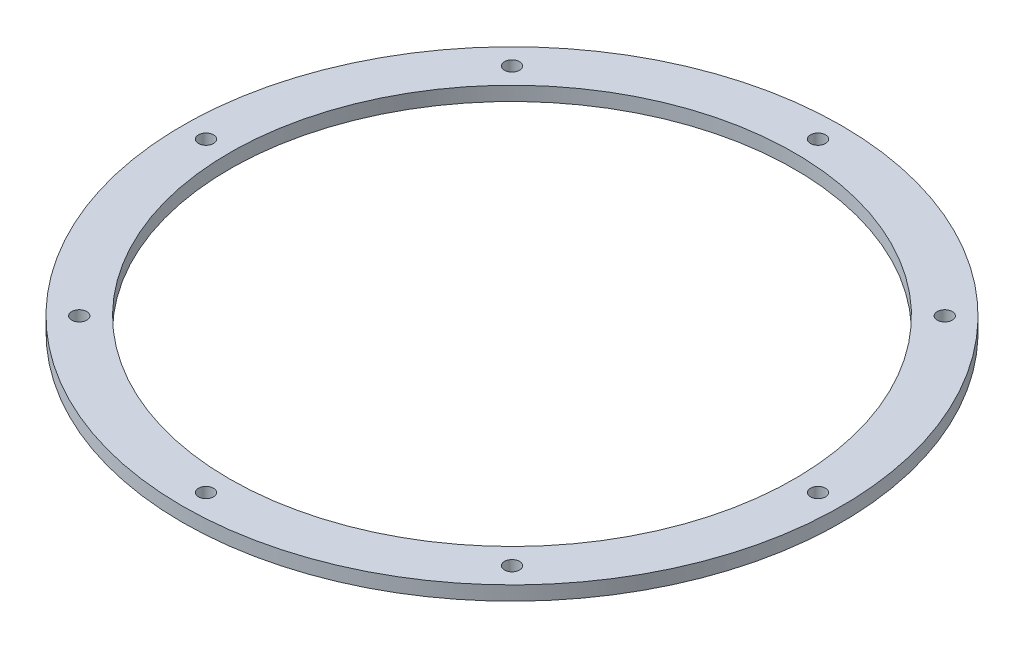
ISO-10303-21;
HEADER;
FILE_DESCRIPTION(('STEP AP214'),'2;1');
FILE_NAME('part.step','',(''),(''),'','','');
FILE_SCHEMA(('AUTOMOTIVE_DESIGN { 1 0 10303 214 1 1 1 1 }'));
ENDSEC;
DATA;
#1=APPLICATION_CONTEXT('core data for automotive mechanical design processes');
#2=APPLICATION_PROTOCOL_DEFINITION('international standard','automotive_design',2000,#1);
#3=PRODUCT_CONTEXT('',#1,'mechanical');
#4=PRODUCT('Part','Part','',(#3));
#5=PRODUCT_RELATED_PRODUCT_CATEGORY('part','',(#4));
#6=PRODUCT_DEFINITION_FORMATION('','',#4);
#7=PRODUCT_DEFINITION_CONTEXT('part definition',#1,'design');
#8=PRODUCT_DEFINITION('design','',#6,#7);
#9=PRODUCT_DEFINITION_SHAPE('','',#8);
#10=(LENGTH_UNIT() NAMED_UNIT(*) SI_UNIT(.MILLI.,.METRE.));
#11=(NAMED_UNIT(*) PLANE_ANGLE_UNIT() SI_UNIT($,.RADIAN.));
#12=(NAMED_UNIT(*) SI_UNIT($,.STERADIAN.) SOLID_ANGLE_UNIT());
#13=UNCERTAINTY_MEASURE_WITH_UNIT(LENGTH_MEASURE(1.E-05),#10,'distance_accuracy_value','');
#14=(GEOMETRIC_REPRESENTATION_CONTEXT(3) GLOBAL_UNCERTAINTY_ASSIGNED_CONTEXT((#13)) GLOBAL_UNIT_ASSIGNED_CONTEXT((#10,
#11,#12)) REPRESENTATION_CONTEXT('',''));
#15=CARTESIAN_POINT('',(0.,0.,0.));
#16=DIRECTION('',(0.,0.,1.));
#17=DIRECTION('',(1.,0.,0.));
#18=AXIS2_PLACEMENT_3D('',#15,#16,#17);
#19=CARTESIAN_POINT('',(0.,3.,0.));
#20=DIRECTION('',(0.,1.,0.));
#21=DIRECTION('',(0.,0.,1.));
#22=AXIS2_PLACEMENT_3D('',#19,#20,#21);
#23=PLANE('',#22);
#24=CARTESIAN_POINT('',(-65.,3.,-6.80838861074411E-13));
#25=DIRECTION('',(0.,1.,0.));
#26=DIRECTION('',(0.,0.,1.));
#27=AXIS2_PLACEMENT_3D('',#24,#25,#26);
#28=CIRCLE('',#27,1.6);
#29=CARTESIAN_POINT('',(-65.,3.,1.59999999999932));
#30=VERTEX_POINT('',#29);
#31=EDGE_CURVE('E108',#30,#30,#28,.T.);
#32=ORIENTED_EDGE('',*,*,#31,.F.);
#33=EDGE_LOOP('',(#32));
#34=FACE_BOUND('',#33,.T.);
#35=CARTESIAN_POINT('',(-4.53892574049607E-13,3.,65.));
#36=DIRECTION('',(0.,1.,0.));
#37=DIRECTION('',(0.,0.,1.));
#38=AXIS2_PLACEMENT_3D('',#35,#36,#37);
#39=CIRCLE('',#38,1.6);
#40=CARTESIAN_POINT('',(-4.53892574049607E-13,3.,66.6));
#41=VERTEX_POINT('',#40);
#42=EDGE_CURVE('E92',#41,#41,#39,.T.);
#43=ORIENTED_EDGE('',*,*,#42,.F.);
#44=EDGE_LOOP('',(#43));
#45=FACE_BOUND('',#44,.T.);
#46=CARTESIAN_POINT('',(65.,3.,2.26946287024804E-13));
#47=DIRECTION('',(0.,1.,0.));
#48=DIRECTION('',(0.,0.,1.));
#49=AXIS2_PLACEMENT_3D('',#46,#47,#48);
#50=CIRCLE('',#49,1.6);
#51=CARTESIAN_POINT('',(65.,3.,1.60000000000023));
#52=VERTEX_POINT('',#51);
#53=EDGE_CURVE('E76',#52,#52,#50,.T.);
#54=ORIENTED_EDGE('',*,*,#53,.F.);
#55=EDGE_LOOP('',(#54));
#56=FACE_BOUND('',#55,.T.);
#57=CARTESIAN_POINT('',(0.,3.,-65.));
#58=DIRECTION('',(0.,1.,0.));
#59=DIRECTION('',(0.,0.,1.));
#60=AXIS2_PLACEMENT_3D('',#57,#58,#59);
#61=CIRCLE('',#60,1.6);
#62=CARTESIAN_POINT('',(0.,3.,-63.4));
#63=VERTEX_POINT('',#62);
#64=EDGE_CURVE('E60',#63,#63,#61,.T.);
#65=ORIENTED_EDGE('',*,*,#64,.F.);
#66=EDGE_LOOP('',(#65));
#67=FACE_BOUND('',#66,.T.);
#68=CARTESIAN_POINT('',(0.,3.,0.));
#69=DIRECTION('',(0.,1.,0.));
#70=DIRECTION('',(0.,0.,1.));
#71=AXIS2_PLACEMENT_3D('',#68,#69,#70);
#72=CIRCLE('',#71,70.);
#73=CARTESIAN_POINT('',(0.,3.,70.));
#74=VERTEX_POINT('',#73);
#75=EDGE_CURVE('E10',#74,#74,#72,.T.);
#76=ORIENTED_EDGE('',*,*,#75,.T.);
#77=EDGE_LOOP('',(#76));
#78=FACE_BOUND('',#77,.T.);
#79=CARTESIAN_POINT('',(0.,3.,0.));
#80=DIRECTION('',(0.,1.,0.));
#81=DIRECTION('',(0.,0.,1.));
#82=AXIS2_PLACEMENT_3D('',#79,#80,#81);
#83=CIRCLE('',#82,60.);
#84=CARTESIAN_POINT('',(0.,3.,60.));
#85=VERTEX_POINT('',#84);
#86=EDGE_CURVE('E54',#85,#85,#83,.T.);
#87=ORIENTED_EDGE('',*,*,#86,.F.);
#88=EDGE_LOOP('',(#87));
#89=FACE_BOUND('',#88,.T.);
#90=CARTESIAN_POINT('',(45.9619407771257,3.,-45.9619407771255));
#91=DIRECTION('',(0.,1.,0.));
#92=DIRECTION('',(0.,0.,1.));
#93=AXIS2_PLACEMENT_3D('',#90,#91,#92);
#94=CIRCLE('',#93,1.6);
#95=CARTESIAN_POINT('',(45.9619407771257,3.,-44.3619407771255));
#96=VERTEX_POINT('',#95);
#97=EDGE_CURVE('E68',#96,#96,#94,.T.);
#98=ORIENTED_EDGE('',*,*,#97,.F.);
#99=EDGE_LOOP('',(#98));
#100=FACE_BOUND('',#99,.T.);
#101=CARTESIAN_POINT('',(45.9619407771253,3.,45.9619407771258));
#102=DIRECTION('',(0.,1.,0.));
#103=DIRECTION('',(0.,0.,1.));
#104=AXIS2_PLACEMENT_3D('',#101,#102,#103);
#105=CIRCLE('',#104,1.6);
#106=CARTESIAN_POINT('',(45.9619407771253,3.,47.5619407771258));
#107=VERTEX_POINT('',#106);
#108=EDGE_CURVE('E84',#107,#107,#105,.T.);
#109=ORIENTED_EDGE('',*,*,#108,.F.);
#110=EDGE_LOOP('',(#109));
#111=FACE_BOUND('',#110,.T.);
#112=CARTESIAN_POINT('',(-45.961940777126,3.,45.9619407771252));
#113=DIRECTION('',(0.,1.,0.));
#114=DIRECTION('',(0.,0.,1.));
#115=AXIS2_PLACEMENT_3D('',#112,#113,#114);
#116=CIRCLE('',#115,1.6);
#117=CARTESIAN_POINT('',(-45.961940777126,3.,47.5619407771252));
#118=VERTEX_POINT('',#117);
#119=EDGE_CURVE('E100',#118,#118,#116,.T.);
#120=ORIENTED_EDGE('',*,*,#119,.F.);
#121=EDGE_LOOP('',(#120));
#122=FACE_BOUND('',#121,.T.);
#123=CARTESIAN_POINT('',(-45.961940777125,3.,-45.9619407771261));
#124=DIRECTION('',(0.,1.,0.));
#125=DIRECTION('',(0.,0.,1.));
#126=AXIS2_PLACEMENT_3D('',#123,#124,#125);
#127=CIRCLE('',#126,1.6);
#128=CARTESIAN_POINT('',(-45.961940777125,3.,-44.3619407771261));
#129=VERTEX_POINT('',#128);
#130=EDGE_CURVE('E116',#129,#129,#127,.T.);
#131=ORIENTED_EDGE('',*,*,#130,.F.);
#132=EDGE_LOOP('',(#131));
#133=FACE_BOUND('',#132,.T.);
#134=ADVANCED_FACE('F41',(#34,#45,#56,#67,#78,#89,#100,#111,#122,#133),#23,.T.);
#135=CARTESIAN_POINT('',(0.,0.,0.));
#136=DIRECTION('',(0.,1.,0.));
#137=DIRECTION('',(0.,0.,1.));
#138=AXIS2_PLACEMENT_3D('',#135,#136,#137);
#139=PLANE('',#138);
#140=CARTESIAN_POINT('',(0.,0.,0.));
#141=DIRECTION('',(0.,1.,0.));
#142=DIRECTION('',(0.,0.,1.));
#143=AXIS2_PLACEMENT_3D('',#140,#141,#142);
#144=CIRCLE('',#143,70.);
#145=CARTESIAN_POINT('',(0.,0.,70.));
#146=VERTEX_POINT('',#145);
#147=EDGE_CURVE('E45',#146,#146,#144,.T.);
#148=ORIENTED_EDGE('',*,*,#147,.F.);
#149=EDGE_LOOP('',(#148));
#150=FACE_BOUND('',#149,.T.);
#151=CARTESIAN_POINT('',(0.,0.,0.));
#152=DIRECTION('',(0.,1.,0.));
#153=DIRECTION('',(0.,0.,1.));
#154=AXIS2_PLACEMENT_3D('',#151,#152,#153);
#155=CIRCLE('',#154,60.);
#156=CARTESIAN_POINT('',(0.,0.,60.));
#157=VERTEX_POINT('',#156);
#158=EDGE_CURVE('E56',#157,#157,#155,.T.);
#159=ORIENTED_EDGE('',*,*,#158,.T.);
#160=EDGE_LOOP('',(#159));
#161=FACE_BOUND('',#160,.T.);
#162=CARTESIAN_POINT('',(0.,0.,-65.));
#163=DIRECTION('',(0.,1.,0.));
#164=DIRECTION('',(0.,0.,1.));
#165=AXIS2_PLACEMENT_3D('',#162,#163,#164);
#166=CIRCLE('',#165,1.6);
#167=CARTESIAN_POINT('',(0.,0.,-63.4));
#168=VERTEX_POINT('',#167);
#169=EDGE_CURVE('E64',#168,#168,#166,.T.);
#170=ORIENTED_EDGE('',*,*,#169,.T.);
#171=EDGE_LOOP('',(#170));
#172=FACE_BOUND('',#171,.T.);
#173=CARTESIAN_POINT('',(45.9619407771257,0.,-45.9619407771255));
#174=DIRECTION('',(0.,1.,0.));
#175=DIRECTION('',(0.,0.,1.));
#176=AXIS2_PLACEMENT_3D('',#173,#174,#175);
#177=CIRCLE('',#176,1.6);
#178=CARTESIAN_POINT('',(45.9619407771257,0.,-44.3619407771255));
#179=VERTEX_POINT('',#178);
#180=EDGE_CURVE('E72',#179,#179,#177,.T.);
#181=ORIENTED_EDGE('',*,*,#180,.T.);
#182=EDGE_LOOP('',(#181));
#183=FACE_BOUND('',#182,.T.);
#184=CARTESIAN_POINT('',(65.,0.,2.26946287024804E-13));
#185=DIRECTION('',(0.,1.,0.));
#186=DIRECTION('',(0.,0.,1.));
#187=AXIS2_PLACEMENT_3D('',#184,#185,#186);
#188=CIRCLE('',#187,1.6);
#189=CARTESIAN_POINT('',(65.,0.,1.60000000000023));
#190=VERTEX_POINT('',#189);
#191=EDGE_CURVE('E80',#190,#190,#188,.T.);
#192=ORIENTED_EDGE('',*,*,#191,.T.);
#193=EDGE_LOOP('',(#192));
#194=FACE_BOUND('',#193,.T.);
#195=CARTESIAN_POINT('',(45.9619407771253,0.,45.9619407771258));
#196=DIRECTION('',(0.,1.,0.));
#197=DIRECTION('',(0.,0.,1.));
#198=AXIS2_PLACEMENT_3D('',#195,#196,#197);
#199=CIRCLE('',#198,1.6);
#200=CARTESIAN_POINT('',(45.9619407771253,0.,47.5619407771258));
#201=VERTEX_POINT('',#200);
#202=EDGE_CURVE('E88',#201,#201,#199,.T.);
#203=ORIENTED_EDGE('',*,*,#202,.T.);
#204=EDGE_LOOP('',(#203));
#205=FACE_BOUND('',#204,.T.);
#206=CARTESIAN_POINT('',(-4.53892574049607E-13,0.,65.));
#207=DIRECTION('',(0.,1.,0.));
#208=DIRECTION('',(0.,0.,1.));
#209=AXIS2_PLACEMENT_3D('',#206,#207,#208);
#210=CIRCLE('',#209,1.6);
#211=CARTESIAN_POINT('',(-4.53892574049607E-13,0.,66.6));
#212=VERTEX_POINT('',#211);
#213=EDGE_CURVE('E96',#212,#212,#210,.T.);
#214=ORIENTED_EDGE('',*,*,#213,.T.);
#215=EDGE_LOOP('',(#214));
#216=FACE_BOUND('',#215,.T.);
#217=CARTESIAN_POINT('',(-45.961940777126,0.,45.9619407771252));
#218=DIRECTION('',(0.,1.,0.));
#219=DIRECTION('',(0.,0.,1.));
#220=AXIS2_PLACEMENT_3D('',#217,#218,#219);
#221=CIRCLE('',#220,1.6);
#222=CARTESIAN_POINT('',(-45.961940777126,0.,47.5619407771252));
#223=VERTEX_POINT('',#222);
#224=EDGE_CURVE('E104',#223,#223,#221,.T.);
#225=ORIENTED_EDGE('',*,*,#224,.T.);
#226=EDGE_LOOP('',(#225));
#227=FACE_BOUND('',#226,.T.);
#228=CARTESIAN_POINT('',(-65.,0.,-6.80838861074411E-13));
#229=DIRECTION('',(0.,1.,0.));
#230=DIRECTION('',(0.,0.,1.));
#231=AXIS2_PLACEMENT_3D('',#228,#229,#230);
#232=CIRCLE('',#231,1.6);
#233=CARTESIAN_POINT('',(-65.,0.,1.59999999999932));
#234=VERTEX_POINT('',#233);
#235=EDGE_CURVE('E112',#234,#234,#232,.T.);
#236=ORIENTED_EDGE('',*,*,#235,.T.);
#237=EDGE_LOOP('',(#236));
#238=FACE_BOUND('',#237,.T.);
#239=CARTESIAN_POINT('',(-45.961940777125,0.,-45.9619407771261));
#240=DIRECTION('',(0.,1.,0.));
#241=DIRECTION('',(0.,0.,1.));
#242=AXIS2_PLACEMENT_3D('',#239,#240,#241);
#243=CIRCLE('',#242,1.6);
#244=CARTESIAN_POINT('',(-45.961940777125,0.,-44.3619407771261));
#245=VERTEX_POINT('',#244);
#246=EDGE_CURVE('E120',#245,#245,#243,.T.);
#247=ORIENTED_EDGE('',*,*,#246,.T.);
#248=EDGE_LOOP('',(#247));
#249=FACE_BOUND('',#248,.T.);
#250=ADVANCED_FACE('F132',(#150,#161,#172,#183,#194,#205,#216,#227,#238,#249),#139,.F.);
#251=CARTESIAN_POINT('',(0.,3.,0.));
#252=DIRECTION('',(0.,-1.,0.));
#253=DIRECTION('',(0.,0.,-1.));
#254=AXIS2_PLACEMENT_3D('',#251,#252,#253);
#255=CYLINDRICAL_SURFACE('',#254,70.);
#256=ORIENTED_EDGE('',*,*,#75,.F.);
#257=EDGE_LOOP('',(#256));
#258=FACE_BOUND('',#257,.T.);
#259=ORIENTED_EDGE('',*,*,#147,.T.);
#260=EDGE_LOOP('',(#259));
#261=FACE_BOUND('',#260,.T.);
#262=ADVANCED_FACE('F43',(#258,#261),#255,.T.);
#263=CARTESIAN_POINT('',(0.,3.,0.));
#264=DIRECTION('',(0.,-1.,0.));
#265=DIRECTION('',(0.,0.,-1.));
#266=AXIS2_PLACEMENT_3D('',#263,#264,#265);
#267=CYLINDRICAL_SURFACE('',#266,60.);
#268=ORIENTED_EDGE('',*,*,#86,.T.);
#269=EDGE_LOOP('',(#268));
#270=FACE_BOUND('',#269,.T.);
#271=ORIENTED_EDGE('',*,*,#158,.F.);
#272=EDGE_LOOP('',(#271));
#273=FACE_BOUND('',#272,.T.);
#274=ADVANCED_FACE('F142',(#270,#273),#267,.F.);
#275=CARTESIAN_POINT('',(0.,3.,-65.));
#276=DIRECTION('',(0.,-1.,0.));
#277=DIRECTION('',(0.,0.,-1.));
#278=AXIS2_PLACEMENT_3D('',#275,#276,#277);
#279=CYLINDRICAL_SURFACE('',#278,1.6);
#280=ORIENTED_EDGE('',*,*,#64,.T.);
#281=EDGE_LOOP('',(#280));
#282=FACE_BOUND('',#281,.T.);
#283=ORIENTED_EDGE('',*,*,#169,.F.);
#284=EDGE_LOOP('',(#283));
#285=FACE_BOUND('',#284,.T.);
#286=ADVANCED_FACE('F145',(#282,#285),#279,.F.);
#287=CARTESIAN_POINT('',(45.9619407771257,3.,-45.9619407771255));
#288=DIRECTION('',(0.,-1.,0.));
#289=DIRECTION('',(0.,0.,-1.));
#290=AXIS2_PLACEMENT_3D('',#287,#288,#289);
#291=CYLINDRICAL_SURFACE('',#290,1.6);
#292=ORIENTED_EDGE('',*,*,#97,.T.);
#293=EDGE_LOOP('',(#292));
#294=FACE_BOUND('',#293,.T.);
#295=ORIENTED_EDGE('',*,*,#180,.F.);
#296=EDGE_LOOP('',(#295));
#297=FACE_BOUND('',#296,.T.);
#298=ADVANCED_FACE('F149',(#294,#297),#291,.F.);
#299=CARTESIAN_POINT('',(65.,3.,2.26946287024804E-13));
#300=DIRECTION('',(0.,-1.,0.));
#301=DIRECTION('',(0.,0.,-1.));
#302=AXIS2_PLACEMENT_3D('',#299,#300,#301);
#303=CYLINDRICAL_SURFACE('',#302,1.6);
#304=ORIENTED_EDGE('',*,*,#53,.T.);
#305=EDGE_LOOP('',(#304));
#306=FACE_BOUND('',#305,.T.);
#307=ORIENTED_EDGE('',*,*,#191,.F.);
#308=EDGE_LOOP('',(#307));
#309=FACE_BOUND('',#308,.T.);
#310=ADVANCED_FACE('F153',(#306,#309),#303,.F.);
#311=CARTESIAN_POINT('',(45.9619407771253,3.,45.9619407771258));
#312=DIRECTION('',(0.,-1.,0.));
#313=DIRECTION('',(0.,0.,-1.));
#314=AXIS2_PLACEMENT_3D('',#311,#312,#313);
#315=CYLINDRICAL_SURFACE('',#314,1.6);
#316=ORIENTED_EDGE('',*,*,#108,.T.);
#317=EDGE_LOOP('',(#316));
#318=FACE_BOUND('',#317,.T.);
#319=ORIENTED_EDGE('',*,*,#202,.F.);
#320=EDGE_LOOP('',(#319));
#321=FACE_BOUND('',#320,.T.);
#322=ADVANCED_FACE('F157',(#318,#321),#315,.F.);
#323=CARTESIAN_POINT('',(-4.53892574049607E-13,3.,65.));
#324=DIRECTION('',(0.,-1.,0.));
#325=DIRECTION('',(0.,0.,-1.));
#326=AXIS2_PLACEMENT_3D('',#323,#324,#325);
#327=CYLINDRICAL_SURFACE('',#326,1.6);
#328=ORIENTED_EDGE('',*,*,#42,.T.);
#329=EDGE_LOOP('',(#328));
#330=FACE_BOUND('',#329,.T.);
#331=ORIENTED_EDGE('',*,*,#213,.F.);
#332=EDGE_LOOP('',(#331));
#333=FACE_BOUND('',#332,.T.);
#334=ADVANCED_FACE('F161',(#330,#333),#327,.F.);
#335=CARTESIAN_POINT('',(-45.961940777126,3.,45.9619407771252));
#336=DIRECTION('',(0.,-1.,0.));
#337=DIRECTION('',(0.,0.,-1.));
#338=AXIS2_PLACEMENT_3D('',#335,#336,#337);
#339=CYLINDRICAL_SURFACE('',#338,1.6);
#340=ORIENTED_EDGE('',*,*,#119,.T.);
#341=EDGE_LOOP('',(#340));
#342=FACE_BOUND('',#341,.T.);
#343=ORIENTED_EDGE('',*,*,#224,.F.);
#344=EDGE_LOOP('',(#343));
#345=FACE_BOUND('',#344,.T.);
#346=ADVANCED_FACE('F165',(#342,#345),#339,.F.);
#347=CARTESIAN_POINT('',(-65.,3.,-6.80838861074411E-13));
#348=DIRECTION('',(0.,-1.,0.));
#349=DIRECTION('',(0.,0.,-1.));
#350=AXIS2_PLACEMENT_3D('',#347,#348,#349);
#351=CYLINDRICAL_SURFACE('',#350,1.6);
#352=ORIENTED_EDGE('',*,*,#31,.T.);
#353=EDGE_LOOP('',(#352));
#354=FACE_BOUND('',#353,.T.);
#355=ORIENTED_EDGE('',*,*,#235,.F.);
#356=EDGE_LOOP('',(#355));
#357=FACE_BOUND('',#356,.T.);
#358=ADVANCED_FACE('F169',(#354,#357),#351,.F.);
#359=CARTESIAN_POINT('',(-45.961940777125,3.,-45.9619407771261));
#360=DIRECTION('',(0.,-1.,0.));
#361=DIRECTION('',(0.,0.,-1.));
#362=AXIS2_PLACEMENT_3D('',#359,#360,#361);
#363=CYLINDRICAL_SURFACE('',#362,1.6);
#364=ORIENTED_EDGE('',*,*,#130,.T.);
#365=EDGE_LOOP('',(#364));
#366=FACE_BOUND('',#365,.T.);
#367=ORIENTED_EDGE('',*,*,#246,.F.);
#368=EDGE_LOOP('',(#367));
#369=FACE_BOUND('',#368,.T.);
#370=ADVANCED_FACE('F128',(#366,#369),#363,.F.);
#371=CLOSED_SHELL('',(#134,#250,#262,#274,#286,#298,#310,#322,#334,#346,#358,#370));
#372=MANIFOLD_SOLID_BREP('B2',#371);
#373=ADVANCED_BREP_SHAPE_REPRESENTATION('',(#18,#372),#14);
#374=SHAPE_DEFINITION_REPRESENTATION(#9,#373);
ENDSEC;
END-ISO-10303-21;
